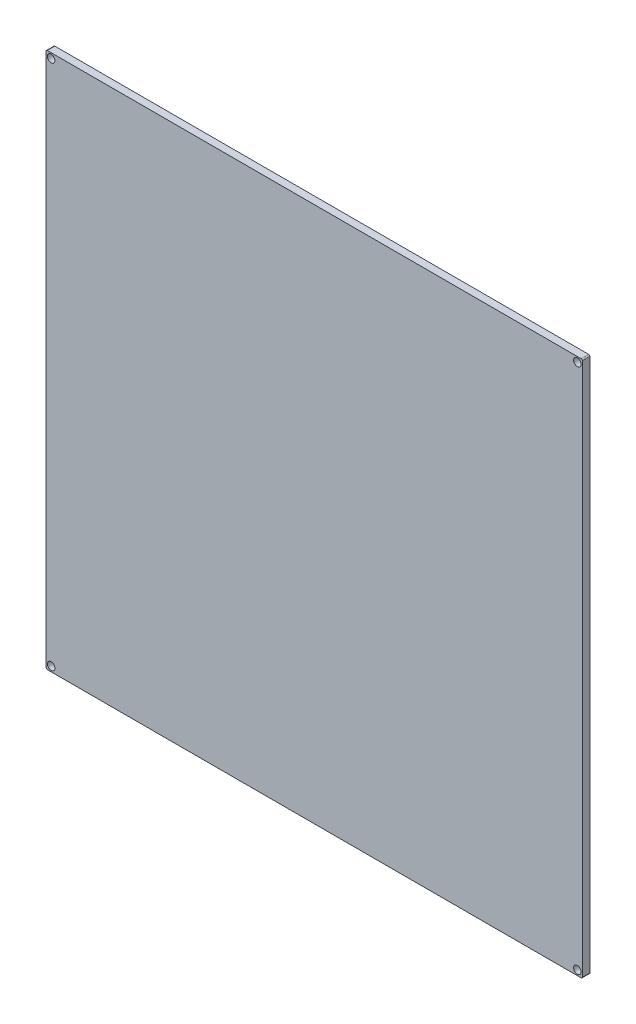
ISO-10303-21;
HEADER;
FILE_DESCRIPTION(('STEP AP214'),'2;1');
FILE_NAME('part.step','',(''),(''),'','','');
FILE_SCHEMA(('AUTOMOTIVE_DESIGN { 1 0 10303 214 1 1 1 1 }'));
ENDSEC;
DATA;
#1=APPLICATION_CONTEXT('core data for automotive mechanical design processes');
#2=APPLICATION_PROTOCOL_DEFINITION('international standard','automotive_design',2000,#1);
#3=PRODUCT_CONTEXT('',#1,'mechanical');
#4=PRODUCT('Part','Part','',(#3));
#5=PRODUCT_RELATED_PRODUCT_CATEGORY('part','',(#4));
#6=PRODUCT_DEFINITION_FORMATION('','',#4);
#7=PRODUCT_DEFINITION_CONTEXT('part definition',#1,'design');
#8=PRODUCT_DEFINITION('design','',#6,#7);
#9=PRODUCT_DEFINITION_SHAPE('','',#8);
#10=(LENGTH_UNIT() NAMED_UNIT(*) SI_UNIT(.MILLI.,.METRE.));
#11=(NAMED_UNIT(*) PLANE_ANGLE_UNIT() SI_UNIT($,.RADIAN.));
#12=(NAMED_UNIT(*) SI_UNIT($,.STERADIAN.) SOLID_ANGLE_UNIT());
#13=UNCERTAINTY_MEASURE_WITH_UNIT(LENGTH_MEASURE(1.E-05),#10,'distance_accuracy_value','');
#14=(GEOMETRIC_REPRESENTATION_CONTEXT(3) GLOBAL_UNCERTAINTY_ASSIGNED_CONTEXT((#13)) GLOBAL_UNIT_ASSIGNED_CONTEXT((#10,
#11,#12)) REPRESENTATION_CONTEXT('',''));
#15=CARTESIAN_POINT('',(0.,0.,0.));
#16=DIRECTION('',(0.,0.,1.));
#17=DIRECTION('',(1.,0.,0.));
#18=AXIS2_PLACEMENT_3D('',#15,#16,#17);
#19=CARTESIAN_POINT('',(106.5,-106.5,0.));
#20=DIRECTION('',(0.,0.,1.));
#21=DIRECTION('',(0.707106781186548,-0.707106781186548,0.));
#22=AXIS2_PLACEMENT_3D('',#19,#20,#21);
#23=CYLINDRICAL_SURFACE('',#22,0.5);
#24=CARTESIAN_POINT('',(106.5,-106.5,3.));
#25=DIRECTION('',(0.,0.,-1.));
#26=DIRECTION('',(0.707106781186548,-0.707106781186548,0.));
#27=AXIS2_PLACEMENT_3D('',#24,#25,#26);
#28=CIRCLE('',#27,0.5);
#29=CARTESIAN_POINT('',(107.,-106.5,3.));
#30=VERTEX_POINT('',#29);
#31=CARTESIAN_POINT('',(106.5,-107.,3.));
#32=VERTEX_POINT('',#31);
#33=EDGE_CURVE('E11',#30,#32,#28,.T.);
#34=ORIENTED_EDGE('',*,*,#33,.T.);
#35=DIRECTION('',(0.,0.,-1.));
#36=VECTOR('',#35,1.);
#37=CARTESIAN_POINT('',(106.5,-107.,0.));
#38=LINE('',#37,#36);
#39=CARTESIAN_POINT('',(106.5,-107.,0.));
#40=VERTEX_POINT('',#39);
#41=EDGE_CURVE('E27',#32,#40,#38,.T.);
#42=ORIENTED_EDGE('',*,*,#41,.T.);
#43=CARTESIAN_POINT('',(106.5,-106.5,0.));
#44=DIRECTION('',(0.,0.,1.));
#45=DIRECTION('',(0.707106781186548,-0.707106781186548,0.));
#46=AXIS2_PLACEMENT_3D('',#43,#44,#45);
#47=CIRCLE('',#46,0.5);
#48=CARTESIAN_POINT('',(107.,-106.5,0.));
#49=VERTEX_POINT('',#48);
#50=EDGE_CURVE('E181',#40,#49,#47,.T.);
#51=ORIENTED_EDGE('',*,*,#50,.T.);
#52=DIRECTION('',(0.,0.,1.));
#53=VECTOR('',#52,1.);
#54=CARTESIAN_POINT('',(107.,-106.5,0.));
#55=LINE('',#54,#53);
#56=EDGE_CURVE('E174',#49,#30,#55,.T.);
#57=ORIENTED_EDGE('',*,*,#56,.T.);
#58=EDGE_LOOP('',(#34,#42,#51,#57));
#59=FACE_BOUND('',#58,.T.);
#60=ADVANCED_FACE('F17',(#59),#23,.T.);
#61=CARTESIAN_POINT('',(-107.,-107.,0.));
#62=DIRECTION('',(0.,-1.,0.));
#63=DIRECTION('',(0.707106781186548,0.,0.707106781186548));
#64=AXIS2_PLACEMENT_3D('',#61,#62,#63);
#65=PLANE('',#64);
#66=ORIENTED_EDGE('',*,*,#41,.F.);
#67=DIRECTION('',(1.,0.,0.));
#68=VECTOR('',#67,1.);
#69=CARTESIAN_POINT('',(107.,-107.,3.));
#70=LINE('',#69,#68);
#71=CARTESIAN_POINT('',(-106.5,-107.,3.));
#72=VERTEX_POINT('',#71);
#73=EDGE_CURVE('E150',#72,#32,#70,.T.);
#74=ORIENTED_EDGE('',*,*,#73,.F.);
#75=DIRECTION('',(0.,0.,1.));
#76=VECTOR('',#75,1.);
#77=CARTESIAN_POINT('',(-106.5,-107.,0.));
#78=LINE('',#77,#76);
#79=CARTESIAN_POINT('',(-106.5,-107.,0.));
#80=VERTEX_POINT('',#79);
#81=EDGE_CURVE('E145',#80,#72,#78,.T.);
#82=ORIENTED_EDGE('',*,*,#81,.F.);
#83=DIRECTION('',(-1.,0.,0.));
#84=VECTOR('',#83,1.);
#85=CARTESIAN_POINT('',(107.,-107.,0.));
#86=LINE('',#85,#84);
#87=EDGE_CURVE('E129',#40,#80,#86,.T.);
#88=ORIENTED_EDGE('',*,*,#87,.F.);
#89=EDGE_LOOP('',(#66,#74,#82,#88));
#90=FACE_BOUND('',#89,.T.);
#91=ADVANCED_FACE('F188',(#90),#65,.T.);
#92=CARTESIAN_POINT('',(0.,0.,3.));
#93=DIRECTION('',(0.,0.,1.));
#94=DIRECTION('',(0.707106781186548,0.707106781186548,0.));
#95=AXIS2_PLACEMENT_3D('',#92,#93,#94);
#96=PLANE('',#95);
#97=CARTESIAN_POINT('',(-105.,-105.,3.));
#98=DIRECTION('',(0.,0.,-1.));
#99=DIRECTION('',(-1.,0.,0.));
#100=AXIS2_PLACEMENT_3D('',#97,#98,#99);
#101=CIRCLE('',#100,1.5);
#102=CARTESIAN_POINT('',(-103.5,-105.,3.));
#103=VERTEX_POINT('',#102);
#104=EDGE_CURVE('E171',#103,#103,#101,.T.);
#105=ORIENTED_EDGE('',*,*,#104,.T.);
#106=EDGE_LOOP('',(#105));
#107=FACE_BOUND('',#106,.T.);
#108=CARTESIAN_POINT('',(105.,105.,3.));
#109=DIRECTION('',(0.,0.,-1.));
#110=DIRECTION('',(-1.,0.,0.));
#111=AXIS2_PLACEMENT_3D('',#108,#109,#110);
#112=CIRCLE('',#111,1.5);
#113=CARTESIAN_POINT('',(106.5,105.,3.));
#114=VERTEX_POINT('',#113);
#115=EDGE_CURVE('E168',#114,#114,#112,.T.);
#116=ORIENTED_EDGE('',*,*,#115,.T.);
#117=EDGE_LOOP('',(#116));
#118=FACE_BOUND('',#117,.T.);
#119=CARTESIAN_POINT('',(-105.,105.,3.));
#120=DIRECTION('',(0.,0.,-1.));
#121=DIRECTION('',(-1.,0.,0.));
#122=AXIS2_PLACEMENT_3D('',#119,#120,#121);
#123=CIRCLE('',#122,1.5);
#124=CARTESIAN_POINT('',(-103.5,105.,3.));
#125=VERTEX_POINT('',#124);
#126=EDGE_CURVE('E165',#125,#125,#123,.T.);
#127=ORIENTED_EDGE('',*,*,#126,.T.);
#128=EDGE_LOOP('',(#127));
#129=FACE_BOUND('',#128,.T.);
#130=CARTESIAN_POINT('',(105.,-105.,3.));
#131=DIRECTION('',(0.,0.,-1.));
#132=DIRECTION('',(-1.,0.,0.));
#133=AXIS2_PLACEMENT_3D('',#130,#131,#132);
#134=CIRCLE('',#133,1.5);
#135=CARTESIAN_POINT('',(106.5,-105.,3.));
#136=VERTEX_POINT('',#135);
#137=EDGE_CURVE('E162',#136,#136,#134,.T.);
#138=ORIENTED_EDGE('',*,*,#137,.T.);
#139=EDGE_LOOP('',(#138));
#140=FACE_BOUND('',#139,.T.);
#141=ORIENTED_EDGE('',*,*,#33,.F.);
#142=DIRECTION('',(0.,1.,0.));
#143=VECTOR('',#142,1.);
#144=CARTESIAN_POINT('',(107.,107.,3.));
#145=LINE('',#144,#143);
#146=CARTESIAN_POINT('',(107.,106.5,3.));
#147=VERTEX_POINT('',#146);
#148=EDGE_CURVE('E158',#30,#147,#145,.T.);
#149=ORIENTED_EDGE('',*,*,#148,.T.);
#150=CARTESIAN_POINT('',(106.5,106.5,3.));
#151=DIRECTION('',(0.,0.,-1.));
#152=DIRECTION('',(0.707106781186548,0.707106781186548,0.));
#153=AXIS2_PLACEMENT_3D('',#150,#151,#152);
#154=CIRCLE('',#153,0.5);
#155=CARTESIAN_POINT('',(106.5,107.,3.));
#156=VERTEX_POINT('',#155);
#157=EDGE_CURVE('E123',#156,#147,#154,.T.);
#158=ORIENTED_EDGE('',*,*,#157,.F.);
#159=DIRECTION('',(-1.,0.,0.));
#160=VECTOR('',#159,1.);
#161=CARTESIAN_POINT('',(-107.,107.,3.));
#162=LINE('',#161,#160);
#163=CARTESIAN_POINT('',(-106.5,107.,3.));
#164=VERTEX_POINT('',#163);
#165=EDGE_CURVE('E154',#156,#164,#162,.T.);
#166=ORIENTED_EDGE('',*,*,#165,.T.);
#167=CARTESIAN_POINT('',(-106.5,106.5,3.));
#168=DIRECTION('',(0.,0.,-1.));
#169=DIRECTION('',(-0.707106781186548,0.707106781186548,0.));
#170=AXIS2_PLACEMENT_3D('',#167,#168,#169);
#171=CIRCLE('',#170,0.5);
#172=CARTESIAN_POINT('',(-107.,106.5,3.));
#173=VERTEX_POINT('',#172);
#174=EDGE_CURVE('E137',#173,#164,#171,.T.);
#175=ORIENTED_EDGE('',*,*,#174,.F.);
#176=DIRECTION('',(0.,-1.,0.));
#177=VECTOR('',#176,1.);
#178=CARTESIAN_POINT('',(-107.,-107.,3.));
#179=LINE('',#178,#177);
#180=CARTESIAN_POINT('',(-107.,-106.5,3.));
#181=VERTEX_POINT('',#180);
#182=EDGE_CURVE('E151',#173,#181,#179,.T.);
#183=ORIENTED_EDGE('',*,*,#182,.T.);
#184=CARTESIAN_POINT('',(-106.5,-106.5,3.));
#185=DIRECTION('',(0.,0.,-1.));
#186=DIRECTION('',(-0.707106781186548,-0.707106781186548,0.));
#187=AXIS2_PLACEMENT_3D('',#184,#185,#186);
#188=CIRCLE('',#187,0.5);
#189=EDGE_CURVE('E148',#72,#181,#188,.T.);
#190=ORIENTED_EDGE('',*,*,#189,.F.);
#191=ORIENTED_EDGE('',*,*,#73,.T.);
#192=EDGE_LOOP('',(#141,#149,#158,#166,#175,#183,#190,#191));
#193=FACE_BOUND('',#192,.T.);
#194=ADVANCED_FACE('F197',(#107,#118,#129,#140,#193),#96,.T.);
#195=CARTESIAN_POINT('',(-106.5,-106.5,0.));
#196=DIRECTION('',(0.,0.,1.));
#197=DIRECTION('',(-0.707106781186548,-0.707106781186548,0.));
#198=AXIS2_PLACEMENT_3D('',#195,#196,#197);
#199=CYLINDRICAL_SURFACE('',#198,0.5);
#200=ORIENTED_EDGE('',*,*,#189,.T.);
#201=DIRECTION('',(0.,0.,-1.));
#202=VECTOR('',#201,1.);
#203=CARTESIAN_POINT('',(-107.,-106.5,0.));
#204=LINE('',#203,#202);
#205=CARTESIAN_POINT('',(-107.,-106.5,0.));
#206=VERTEX_POINT('',#205);
#207=EDGE_CURVE('E144',#181,#206,#204,.T.);
#208=ORIENTED_EDGE('',*,*,#207,.T.);
#209=CARTESIAN_POINT('',(-106.5,-106.5,0.));
#210=DIRECTION('',(0.,0.,1.));
#211=DIRECTION('',(-0.707106781186548,-0.707106781186548,0.));
#212=AXIS2_PLACEMENT_3D('',#209,#210,#211);
#213=CIRCLE('',#212,0.5);
#214=EDGE_CURVE('E141',#206,#80,#213,.T.);
#215=ORIENTED_EDGE('',*,*,#214,.T.);
#216=ORIENTED_EDGE('',*,*,#81,.T.);
#217=EDGE_LOOP('',(#200,#208,#215,#216));
#218=FACE_BOUND('',#217,.T.);
#219=ADVANCED_FACE('F202',(#218),#199,.T.);
#220=CARTESIAN_POINT('',(-107.,107.,0.));
#221=DIRECTION('',(-1.,0.,0.));
#222=DIRECTION('',(0.,0.707106781186548,0.707106781186548));
#223=AXIS2_PLACEMENT_3D('',#220,#221,#222);
#224=PLANE('',#223);
#225=ORIENTED_EDGE('',*,*,#207,.F.);
#226=ORIENTED_EDGE('',*,*,#182,.F.);
#227=DIRECTION('',(0.,0.,1.));
#228=VECTOR('',#227,1.);
#229=CARTESIAN_POINT('',(-107.,106.5,0.));
#230=LINE('',#229,#228);
#231=CARTESIAN_POINT('',(-107.,106.5,0.));
#232=VERTEX_POINT('',#231);
#233=EDGE_CURVE('E134',#232,#173,#230,.T.);
#234=ORIENTED_EDGE('',*,*,#233,.F.);
#235=DIRECTION('',(0.,1.,0.));
#236=VECTOR('',#235,1.);
#237=CARTESIAN_POINT('',(-107.,-107.,0.));
#238=LINE('',#237,#236);
#239=EDGE_CURVE('E126',#206,#232,#238,.T.);
#240=ORIENTED_EDGE('',*,*,#239,.F.);
#241=EDGE_LOOP('',(#225,#226,#234,#240));
#242=FACE_BOUND('',#241,.T.);
#243=ADVANCED_FACE('F206',(#242),#224,.T.);
#244=CARTESIAN_POINT('',(-106.5,106.5,0.));
#245=DIRECTION('',(0.,0.,1.));
#246=DIRECTION('',(-0.707106781186548,0.707106781186548,0.));
#247=AXIS2_PLACEMENT_3D('',#244,#245,#246);
#248=CYLINDRICAL_SURFACE('',#247,0.5);
#249=ORIENTED_EDGE('',*,*,#174,.T.);
#250=DIRECTION('',(0.,0.,-1.));
#251=VECTOR('',#250,1.);
#252=CARTESIAN_POINT('',(-106.5,107.,0.));
#253=LINE('',#252,#251);
#254=CARTESIAN_POINT('',(-106.5,107.,0.));
#255=VERTEX_POINT('',#254);
#256=EDGE_CURVE('E133',#164,#255,#253,.T.);
#257=ORIENTED_EDGE('',*,*,#256,.T.);
#258=CARTESIAN_POINT('',(-106.5,106.5,0.));
#259=DIRECTION('',(0.,0.,1.));
#260=DIRECTION('',(-0.707106781186548,0.707106781186548,0.));
#261=AXIS2_PLACEMENT_3D('',#258,#259,#260);
#262=CIRCLE('',#261,0.5);
#263=EDGE_CURVE('E130',#255,#232,#262,.T.);
#264=ORIENTED_EDGE('',*,*,#263,.T.);
#265=ORIENTED_EDGE('',*,*,#233,.T.);
#266=EDGE_LOOP('',(#249,#257,#264,#265));
#267=FACE_BOUND('',#266,.T.);
#268=ADVANCED_FACE('F211',(#267),#248,.T.);
#269=CARTESIAN_POINT('',(107.,107.,0.));
#270=DIRECTION('',(0.,1.,0.));
#271=DIRECTION('',(0.707106781186548,0.,0.707106781186548));
#272=AXIS2_PLACEMENT_3D('',#269,#270,#271);
#273=PLANE('',#272);
#274=ORIENTED_EDGE('',*,*,#256,.F.);
#275=ORIENTED_EDGE('',*,*,#165,.F.);
#276=DIRECTION('',(0.,0.,1.));
#277=VECTOR('',#276,1.);
#278=CARTESIAN_POINT('',(106.5,107.,0.));
#279=LINE('',#278,#277);
#280=CARTESIAN_POINT('',(106.5,107.,0.));
#281=VERTEX_POINT('',#280);
#282=EDGE_CURVE('E120',#281,#156,#279,.T.);
#283=ORIENTED_EDGE('',*,*,#282,.F.);
#284=DIRECTION('',(1.,0.,0.));
#285=VECTOR('',#284,1.);
#286=CARTESIAN_POINT('',(-107.,107.,0.));
#287=LINE('',#286,#285);
#288=EDGE_CURVE('E124',#255,#281,#287,.T.);
#289=ORIENTED_EDGE('',*,*,#288,.F.);
#290=EDGE_LOOP('',(#274,#275,#283,#289));
#291=FACE_BOUND('',#290,.T.);
#292=ADVANCED_FACE('F214',(#291),#273,.T.);
#293=CARTESIAN_POINT('',(106.5,106.5,0.));
#294=DIRECTION('',(0.,0.,1.));
#295=DIRECTION('',(0.707106781186548,0.707106781186548,0.));
#296=AXIS2_PLACEMENT_3D('',#293,#294,#295);
#297=CYLINDRICAL_SURFACE('',#296,0.5);
#298=ORIENTED_EDGE('',*,*,#157,.T.);
#299=DIRECTION('',(0.,0.,-1.));
#300=VECTOR('',#299,1.);
#301=CARTESIAN_POINT('',(107.,106.5,0.));
#302=LINE('',#301,#300);
#303=CARTESIAN_POINT('',(107.,106.5,0.));
#304=VERTEX_POINT('',#303);
#305=EDGE_CURVE('E119',#147,#304,#302,.T.);
#306=ORIENTED_EDGE('',*,*,#305,.T.);
#307=CARTESIAN_POINT('',(106.5,106.5,0.));
#308=DIRECTION('',(0.,0.,1.));
#309=DIRECTION('',(0.707106781186548,0.707106781186548,0.));
#310=AXIS2_PLACEMENT_3D('',#307,#308,#309);
#311=CIRCLE('',#310,0.5);
#312=EDGE_CURVE('E116',#304,#281,#311,.T.);
#313=ORIENTED_EDGE('',*,*,#312,.T.);
#314=ORIENTED_EDGE('',*,*,#282,.T.);
#315=EDGE_LOOP('',(#298,#306,#313,#314));
#316=FACE_BOUND('',#315,.T.);
#317=ADVANCED_FACE('F216',(#316),#297,.T.);
#318=CARTESIAN_POINT('',(-105.,-105.,302.656571050424));
#319=DIRECTION('',(0.,0.,-1.));
#320=DIRECTION('',(-1.,0.,0.));
#321=AXIS2_PLACEMENT_3D('',#318,#319,#320);
#322=CYLINDRICAL_SURFACE('',#321,1.5);
#323=ORIENTED_EDGE('',*,*,#104,.F.);
#324=EDGE_LOOP('',(#323));
#325=FACE_BOUND('',#324,.T.);
#326=CARTESIAN_POINT('',(-105.,-105.,0.));
#327=DIRECTION('',(0.,0.,1.));
#328=DIRECTION('',(-1.,0.,0.));
#329=AXIS2_PLACEMENT_3D('',#326,#327,#328);
#330=CIRCLE('',#329,1.5);
#331=CARTESIAN_POINT('',(-106.5,-105.,0.));
#332=VERTEX_POINT('',#331);
#333=EDGE_CURVE('E113',#332,#332,#330,.T.);
#334=ORIENTED_EDGE('',*,*,#333,.F.);
#335=EDGE_LOOP('',(#334));
#336=FACE_BOUND('',#335,.T.);
#337=ADVANCED_FACE('F218',(#325,#336),#322,.F.);
#338=CARTESIAN_POINT('',(105.,105.,302.656571050424));
#339=DIRECTION('',(0.,0.,-1.));
#340=DIRECTION('',(-1.,0.,0.));
#341=AXIS2_PLACEMENT_3D('',#338,#339,#340);
#342=CYLINDRICAL_SURFACE('',#341,1.5);
#343=ORIENTED_EDGE('',*,*,#115,.F.);
#344=EDGE_LOOP('',(#343));
#345=FACE_BOUND('',#344,.T.);
#346=CARTESIAN_POINT('',(105.,105.,0.));
#347=DIRECTION('',(0.,0.,1.));
#348=DIRECTION('',(-1.,0.,0.));
#349=AXIS2_PLACEMENT_3D('',#346,#347,#348);
#350=CIRCLE('',#349,1.5);
#351=CARTESIAN_POINT('',(103.5,105.,0.));
#352=VERTEX_POINT('',#351);
#353=EDGE_CURVE('E108',#352,#352,#350,.T.);
#354=ORIENTED_EDGE('',*,*,#353,.F.);
#355=EDGE_LOOP('',(#354));
#356=FACE_BOUND('',#355,.T.);
#357=ADVANCED_FACE('F225',(#345,#356),#342,.F.);
#358=CARTESIAN_POINT('',(-105.,105.,302.656571050424));
#359=DIRECTION('',(0.,0.,-1.));
#360=DIRECTION('',(-1.,0.,0.));
#361=AXIS2_PLACEMENT_3D('',#358,#359,#360);
#362=CYLINDRICAL_SURFACE('',#361,1.5);
#363=ORIENTED_EDGE('',*,*,#126,.F.);
#364=EDGE_LOOP('',(#363));
#365=FACE_BOUND('',#364,.T.);
#366=CARTESIAN_POINT('',(-105.,105.,0.));
#367=DIRECTION('',(0.,0.,1.));
#368=DIRECTION('',(-1.,0.,0.));
#369=AXIS2_PLACEMENT_3D('',#366,#367,#368);
#370=CIRCLE('',#369,1.5);
#371=CARTESIAN_POINT('',(-106.5,105.,0.));
#372=VERTEX_POINT('',#371);
#373=EDGE_CURVE('E101',#372,#372,#370,.T.);
#374=ORIENTED_EDGE('',*,*,#373,.F.);
#375=EDGE_LOOP('',(#374));
#376=FACE_BOUND('',#375,.T.);
#377=ADVANCED_FACE('F282',(#365,#376),#362,.F.);
#378=CARTESIAN_POINT('',(105.,-105.,302.656571050424));
#379=DIRECTION('',(0.,0.,-1.));
#380=DIRECTION('',(-1.,0.,0.));
#381=AXIS2_PLACEMENT_3D('',#378,#379,#380);
#382=CYLINDRICAL_SURFACE('',#381,1.5);
#383=ORIENTED_EDGE('',*,*,#137,.F.);
#384=EDGE_LOOP('',(#383));
#385=FACE_BOUND('',#384,.T.);
#386=CARTESIAN_POINT('',(105.,-105.,0.));
#387=DIRECTION('',(0.,0.,1.));
#388=DIRECTION('',(-1.,0.,0.));
#389=AXIS2_PLACEMENT_3D('',#386,#387,#388);
#390=CIRCLE('',#389,1.5);
#391=CARTESIAN_POINT('',(103.5,-105.,0.));
#392=VERTEX_POINT('',#391);
#393=EDGE_CURVE('E105',#392,#392,#390,.T.);
#394=ORIENTED_EDGE('',*,*,#393,.F.);
#395=EDGE_LOOP('',(#394));
#396=FACE_BOUND('',#395,.T.);
#397=ADVANCED_FACE('F106',(#385,#396),#382,.F.);
#398=CARTESIAN_POINT('',(107.,-107.,0.));
#399=DIRECTION('',(1.,0.,0.));
#400=DIRECTION('',(0.,0.707106781186548,0.707106781186548));
#401=AXIS2_PLACEMENT_3D('',#398,#399,#400);
#402=PLANE('',#401);
#403=ORIENTED_EDGE('',*,*,#56,.F.);
#404=DIRECTION('',(0.,-1.,0.));
#405=VECTOR('',#404,1.);
#406=CARTESIAN_POINT('',(107.,107.,0.));
#407=LINE('',#406,#405);
#408=EDGE_CURVE('E21',#304,#49,#407,.T.);
#409=ORIENTED_EDGE('',*,*,#408,.F.);
#410=ORIENTED_EDGE('',*,*,#305,.F.);
#411=ORIENTED_EDGE('',*,*,#148,.F.);
#412=EDGE_LOOP('',(#403,#409,#410,#411));
#413=FACE_BOUND('',#412,.T.);
#414=ADVANCED_FACE('F194',(#413),#402,.T.);
#415=CARTESIAN_POINT('',(0.,0.,0.));
#416=DIRECTION('',(0.,0.,1.));
#417=DIRECTION('',(0.707106781186548,0.707106781186548,0.));
#418=AXIS2_PLACEMENT_3D('',#415,#416,#417);
#419=PLANE('',#418);
#420=ORIENTED_EDGE('',*,*,#50,.F.);
#421=ORIENTED_EDGE('',*,*,#87,.T.);
#422=ORIENTED_EDGE('',*,*,#214,.F.);
#423=ORIENTED_EDGE('',*,*,#239,.T.);
#424=ORIENTED_EDGE('',*,*,#263,.F.);
#425=ORIENTED_EDGE('',*,*,#288,.T.);
#426=ORIENTED_EDGE('',*,*,#312,.F.);
#427=ORIENTED_EDGE('',*,*,#408,.T.);
#428=EDGE_LOOP('',(#420,#421,#422,#423,#424,#425,#426,#427));
#429=FACE_BOUND('',#428,.T.);
#430=ORIENTED_EDGE('',*,*,#333,.T.);
#431=EDGE_LOOP('',(#430));
#432=FACE_BOUND('',#431,.T.);
#433=ORIENTED_EDGE('',*,*,#353,.T.);
#434=EDGE_LOOP('',(#433));
#435=FACE_BOUND('',#434,.T.);
#436=ORIENTED_EDGE('',*,*,#373,.T.);
#437=EDGE_LOOP('',(#436));
#438=FACE_BOUND('',#437,.T.);
#439=ORIENTED_EDGE('',*,*,#393,.T.);
#440=EDGE_LOOP('',(#439));
#441=FACE_BOUND('',#440,.T.);
#442=ADVANCED_FACE('F19',(#429,#432,#435,#438,#441),#419,.F.);
#443=CLOSED_SHELL('',(#60,#91,#194,#219,#243,#268,#292,#317,#337,#357,#377,#397,#414,#442));
#444=MANIFOLD_SOLID_BREP('B1',#443);
#445=ADVANCED_BREP_SHAPE_REPRESENTATION('',(#18,#444),#14);
#446=SHAPE_DEFINITION_REPRESENTATION(#9,#445);
ENDSEC;
END-ISO-10303-21;
